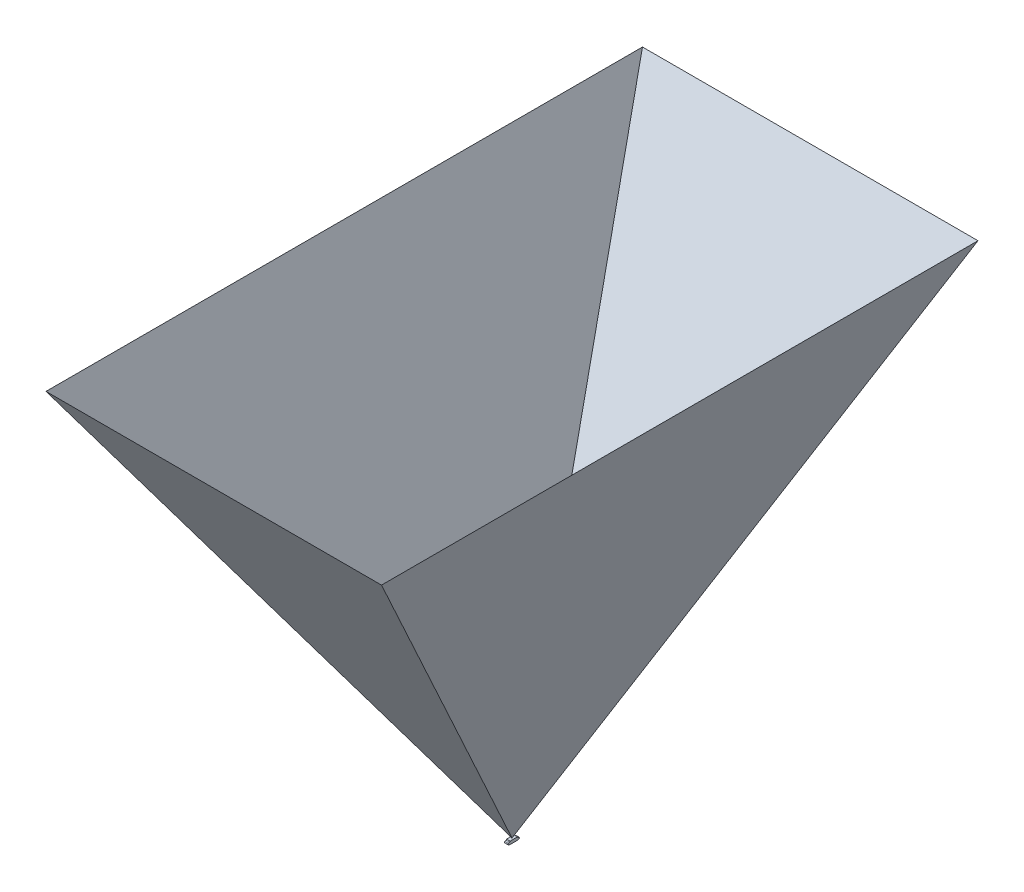
ISO-10303-21;
HEADER;
FILE_DESCRIPTION(('STEP AP214'),'2;1');
FILE_NAME('part.step','',(''),(''),'','','');
FILE_SCHEMA(('AUTOMOTIVE_DESIGN { 1 0 10303 214 1 1 1 1 }'));
ENDSEC;
DATA;
#1=APPLICATION_CONTEXT('core data for automotive mechanical design processes');
#2=APPLICATION_PROTOCOL_DEFINITION('international standard','automotive_design',2000,#1);
#3=PRODUCT_CONTEXT('',#1,'mechanical');
#4=PRODUCT('Part','Part','',(#3));
#5=PRODUCT_RELATED_PRODUCT_CATEGORY('part','',(#4));
#6=PRODUCT_DEFINITION_FORMATION('','',#4);
#7=PRODUCT_DEFINITION_CONTEXT('part definition',#1,'design');
#8=PRODUCT_DEFINITION('design','',#6,#7);
#9=PRODUCT_DEFINITION_SHAPE('','',#8);
#10=(LENGTH_UNIT() NAMED_UNIT(*) SI_UNIT(.MILLI.,.METRE.));
#11=(NAMED_UNIT(*) PLANE_ANGLE_UNIT() SI_UNIT($,.RADIAN.));
#12=(NAMED_UNIT(*) SI_UNIT($,.STERADIAN.) SOLID_ANGLE_UNIT());
#13=UNCERTAINTY_MEASURE_WITH_UNIT(LENGTH_MEASURE(1.E-05),#10,'distance_accuracy_value','');
#14=(GEOMETRIC_REPRESENTATION_CONTEXT(3) GLOBAL_UNCERTAINTY_ASSIGNED_CONTEXT((#13)) GLOBAL_UNIT_ASSIGNED_CONTEXT((#10,
#11,#12)) REPRESENTATION_CONTEXT('',''));
#15=CARTESIAN_POINT('',(0.,0.,0.));
#16=DIRECTION('',(0.,0.,1.));
#17=DIRECTION('',(1.,0.,0.));
#18=AXIS2_PLACEMENT_3D('',#15,#16,#17);
#19=CARTESIAN_POINT('',(0.,0.,0.));
#20=DIRECTION('',(-0.937515374309558,-0.347943850259218,0.));
#21=DIRECTION('',(0.347943850259218,-0.937515374309558,0.));
#22=AXIS2_PLACEMENT_3D('',#19,#20,#21);
#23=PLANE('',#22);
#24=DIRECTION('',(-0.295908180420517,0.797308152799726,0.526058987414252));
#25=VECTOR('',#24,1.);
#26=CARTESIAN_POINT('',(0.,0.,0.));
#27=LINE('',#26,#25);
#28=CARTESIAN_POINT('',(0.,0.,0.));
#29=VERTEX_POINT('',#28);
#30=CARTESIAN_POINT('',(-1371.6,3695.7,2438.4));
#31=VERTEX_POINT('',#30);
#32=EDGE_CURVE('E81',#29,#31,#27,.T.);
#33=ORIENTED_EDGE('',*,*,#32,.T.);
#34=DIRECTION('',(0.,0.,1.));
#35=VECTOR('',#34,1.);
#36=CARTESIAN_POINT('',(-1371.6,3695.7,-2438.4));
#37=LINE('',#36,#35);
#38=CARTESIAN_POINT('',(-1371.6,3695.7,-2438.4));
#39=VERTEX_POINT('',#38);
#40=EDGE_CURVE('E87',#39,#31,#37,.T.);
#41=ORIENTED_EDGE('',*,*,#40,.F.);
#42=DIRECTION('',(-0.295908180420517,0.797308152799726,-0.526058987414252));
#43=VECTOR('',#42,1.);
#44=CARTESIAN_POINT('',(0.,0.,0.));
#45=LINE('',#44,#43);
#46=EDGE_CURVE('E89',#29,#39,#45,.T.);
#47=ORIENTED_EDGE('',*,*,#46,.F.);
#48=EDGE_LOOP('',(#33,#41,#47));
#49=FACE_BOUND('',#48,.T.);
#50=ADVANCED_FACE('F47',(#49),#23,.T.);
#51=CARTESIAN_POINT('',(0.,-2.44569840803106E-13,-3.70676164967207E-13));
#52=DIRECTION('',(0.,0.550722321953465,0.83468851921072));
#53=DIRECTION('',(0.,-0.83468851921072,0.550722321953465));
#54=AXIS2_PLACEMENT_3D('',#51,#52,#53);
#55=PLANE('',#54);
#56=ORIENTED_EDGE('',*,*,#46,.T.);
#57=DIRECTION('',(-1.,0.,0.));
#58=VECTOR('',#57,1.);
#59=CARTESIAN_POINT('',(-1371.6,3695.7,-2438.4));
#60=LINE('',#59,#58);
#61=CARTESIAN_POINT('',(1371.6,3695.7,-2438.4));
#62=VERTEX_POINT('',#61);
#63=EDGE_CURVE('E61',#62,#39,#60,.T.);
#64=ORIENTED_EDGE('',*,*,#63,.F.);
#65=DIRECTION('',(0.295908180420517,0.797308152799726,-0.526058987414252));
#66=VECTOR('',#65,1.);
#67=CARTESIAN_POINT('',(0.,0.,0.));
#68=LINE('',#67,#66);
#69=EDGE_CURVE('E50',#29,#62,#68,.T.);
#70=ORIENTED_EDGE('',*,*,#69,.F.);
#71=EDGE_LOOP('',(#56,#64,#70));
#72=FACE_BOUND('',#71,.T.);
#73=ADVANCED_FACE('F91',(#72),#55,.F.);
#74=CARTESIAN_POINT('',(0.,-2.44569840803106E-13,3.70676164967207E-13));
#75=DIRECTION('',(0.,0.550722321953465,-0.83468851921072));
#76=DIRECTION('',(0.,0.83468851921072,0.550722321953465));
#77=AXIS2_PLACEMENT_3D('',#74,#75,#76);
#78=PLANE('',#77);
#79=DIRECTION('',(0.295908180420517,0.797308152799726,0.526058987414252));
#80=VECTOR('',#79,1.);
#81=CARTESIAN_POINT('',(0.,0.,0.));
#82=LINE('',#81,#80);
#83=CARTESIAN_POINT('',(1371.6,3695.7,2438.4));
#84=VERTEX_POINT('',#83);
#85=EDGE_CURVE('E75',#29,#84,#82,.T.);
#86=ORIENTED_EDGE('',*,*,#85,.T.);
#87=DIRECTION('',(1.,0.,0.));
#88=VECTOR('',#87,1.);
#89=CARTESIAN_POINT('',(-1371.6,3695.7,2438.4));
#90=LINE('',#89,#88);
#91=EDGE_CURVE('E78',#31,#84,#90,.T.);
#92=ORIENTED_EDGE('',*,*,#91,.F.);
#93=ORIENTED_EDGE('',*,*,#32,.F.);
#94=EDGE_LOOP('',(#86,#92,#93));
#95=FACE_BOUND('',#94,.T.);
#96=ADVANCED_FACE('F83',(#95),#78,.F.);
#97=CARTESIAN_POINT('',(0.,0.,0.));
#98=DIRECTION('',(0.937515374309558,-0.347943850259217,0.));
#99=DIRECTION('',(0.347943850259217,0.937515374309558,0.));
#100=AXIS2_PLACEMENT_3D('',#97,#98,#99);
#101=PLANE('',#100);
#102=ORIENTED_EDGE('',*,*,#69,.T.);
#103=DIRECTION('',(0.,0.,-1.));
#104=VECTOR('',#103,1.);
#105=CARTESIAN_POINT('',(1371.6,3695.7,-2438.4));
#106=LINE('',#105,#104);
#107=EDGE_CURVE('E12',#84,#62,#106,.T.);
#108=ORIENTED_EDGE('',*,*,#107,.F.);
#109=ORIENTED_EDGE('',*,*,#85,.F.);
#110=EDGE_LOOP('',(#102,#108,#109));
#111=FACE_BOUND('',#110,.T.);
#112=ADVANCED_FACE('F48',(#111),#101,.T.);
#113=OPEN_SHELL('',(#50,#73,#96,#112));
#114=SHELL_BASED_SURFACE_MODEL('B2',(#113));
#115=CARTESIAN_POINT('',(14.478,0.,30.48));
#116=DIRECTION('',(0.,-1.,0.));
#117=DIRECTION('',(0.,0.,-1.));
#118=AXIS2_PLACEMENT_3D('',#115,#116,#117);
#119=PLANE('',#118);
#120=CARTESIAN_POINT('',(0.,0.,0.));
#121=DIRECTION('',(0.,1.,0.));
#122=DIRECTION('',(0.,0.,1.));
#123=AXIS2_PLACEMENT_3D('',#120,#121,#122);
#124=CIRCLE('',#123,3.175);
#125=CARTESIAN_POINT('',(0.,0.,3.175));
#126=VERTEX_POINT('',#125);
#127=EDGE_CURVE('E325',#126,#126,#124,.T.);
#128=ORIENTED_EDGE('',*,*,#127,.F.);
#129=EDGE_LOOP('',(#128));
#130=FACE_BOUND('',#129,.T.);
#131=DIRECTION('',(0.,0.,1.));
#132=VECTOR('',#131,1.);
#133=CARTESIAN_POINT('',(-14.478,0.,30.48));
#134=LINE('',#133,#132);
#135=CARTESIAN_POINT('',(-14.478,0.,-30.48));
#136=VERTEX_POINT('',#135);
#137=CARTESIAN_POINT('',(-14.478,0.,30.48));
#138=VERTEX_POINT('',#137);
#139=EDGE_CURVE('E221',#136,#138,#134,.T.);
#140=ORIENTED_EDGE('',*,*,#139,.T.);
#141=DIRECTION('',(-1.,0.,0.));
#142=VECTOR('',#141,1.);
#143=CARTESIAN_POINT('',(14.478,0.,30.48));
#144=LINE('',#143,#142);
#145=CARTESIAN_POINT('',(14.478,0.,30.48));
#146=VERTEX_POINT('',#145);
#147=EDGE_CURVE('E146',#146,#138,#144,.T.);
#148=ORIENTED_EDGE('',*,*,#147,.F.);
#149=DIRECTION('',(0.,0.,1.));
#150=VECTOR('',#149,1.);
#151=CARTESIAN_POINT('',(14.478,0.,30.48));
#152=LINE('',#151,#150);
#153=CARTESIAN_POINT('',(14.478,0.,-30.48));
#154=VERTEX_POINT('',#153);
#155=EDGE_CURVE('E233',#154,#146,#152,.T.);
#156=ORIENTED_EDGE('',*,*,#155,.F.);
#157=DIRECTION('',(-1.,0.,0.));
#158=VECTOR('',#157,1.);
#159=CARTESIAN_POINT('',(14.478,0.,-30.48));
#160=LINE('',#159,#158);
#161=EDGE_CURVE('E225',#154,#136,#160,.T.);
#162=ORIENTED_EDGE('',*,*,#161,.T.);
#163=EDGE_LOOP('',(#140,#148,#156,#162));
#164=FACE_BOUND('',#163,.T.);
#165=ADVANCED_FACE('F138',(#130,#164),#119,.F.);
#166=CARTESIAN_POINT('',(14.478,0.,36.9502724798094));
#167=DIRECTION('',(-1.,0.,0.));
#168=DIRECTION('',(0.,0.,1.));
#169=AXIS2_PLACEMENT_3D('',#166,#167,#168);
#170=CYLINDRICAL_SURFACE('',#169,6.47027247980943);
#171=CARTESIAN_POINT('',(-14.478,0.,36.9502724798094));
#172=DIRECTION('',(-1.,0.,0.));
#173=DIRECTION('',(0.,0.,-1.));
#174=AXIS2_PLACEMENT_3D('',#171,#172,#173);
#175=CIRCLE('',#174,6.47027247980943);
#176=CARTESIAN_POINT('',(-14.478,-6.08006730375107,34.7373089589089));
#177=VERTEX_POINT('',#176);
#178=EDGE_CURVE('E224',#138,#177,#175,.T.);
#179=ORIENTED_EDGE('',*,*,#178,.T.);
#180=DIRECTION('',(-1.,0.,0.));
#181=VECTOR('',#180,1.);
#182=CARTESIAN_POINT('',(14.478,-6.08006730375107,34.7373089589089));
#183=LINE('',#182,#181);
#184=CARTESIAN_POINT('',(14.478,-6.08006730375107,34.7373089589089));
#185=VERTEX_POINT('',#184);
#186=EDGE_CURVE('E210',#185,#177,#183,.T.);
#187=ORIENTED_EDGE('',*,*,#186,.F.);
#188=CARTESIAN_POINT('',(14.478,0.,36.9502724798094));
#189=DIRECTION('',(-1.,0.,0.));
#190=DIRECTION('',(0.,0.,-1.));
#191=AXIS2_PLACEMENT_3D('',#188,#189,#190);
#192=CIRCLE('',#191,6.47027247980943);
#193=EDGE_CURVE('E190',#146,#185,#192,.T.);
#194=ORIENTED_EDGE('',*,*,#193,.F.);
#195=ORIENTED_EDGE('',*,*,#147,.T.);
#196=EDGE_LOOP('',(#179,#187,#194,#195));
#197=FACE_BOUND('',#196,.T.);
#198=ADVANCED_FACE('F237',(#197),#170,.F.);
#199=CARTESIAN_POINT('',(14.478,-9.01895185800947,42.811827910118));
#200=DIRECTION('',(0.,-0.93969262078591,-0.342020143325664));
#201=DIRECTION('',(0.,0.342020143325664,-0.93969262078591));
#202=AXIS2_PLACEMENT_3D('',#199,#200,#201);
#203=PLANE('',#202);
#204=DIRECTION('',(0.,-0.342020143325664,0.93969262078591));
#205=VECTOR('',#204,1.);
#206=CARTESIAN_POINT('',(-14.478,-9.01895185800947,42.811827910118));
#207=LINE('',#206,#205);
#208=CARTESIAN_POINT('',(-14.478,-9.01895185800948,42.811827910118));
#209=VERTEX_POINT('',#208);
#210=EDGE_CURVE('E209',#177,#209,#207,.T.);
#211=ORIENTED_EDGE('',*,*,#210,.T.);
#212=DIRECTION('',(-1.,0.,0.));
#213=VECTOR('',#212,1.);
#214=CARTESIAN_POINT('',(14.478,-9.01895185800948,42.811827910118));
#215=LINE('',#214,#213);
#216=CARTESIAN_POINT('',(14.478,-9.01895185800948,42.811827910118));
#217=VERTEX_POINT('',#216);
#218=EDGE_CURVE('E206',#217,#209,#215,.T.);
#219=ORIENTED_EDGE('',*,*,#218,.F.);
#220=DIRECTION('',(0.,-0.342020143325664,0.93969262078591));
#221=VECTOR('',#220,1.);
#222=CARTESIAN_POINT('',(14.478,-9.01895185800947,42.811827910118));
#223=LINE('',#222,#221);
#224=EDGE_CURVE('E198',#185,#217,#223,.T.);
#225=ORIENTED_EDGE('',*,*,#224,.F.);
#226=ORIENTED_EDGE('',*,*,#186,.T.);
#227=EDGE_LOOP('',(#211,#219,#225,#226));
#228=FACE_BOUND('',#227,.T.);
#229=ADVANCED_FACE('F207',(#228),#203,.F.);
#230=CARTESIAN_POINT('',(14.478,-14.986,40.64));
#231=DIRECTION('',(-1.,0.,0.));
#232=DIRECTION('',(0.,0.,1.));
#233=AXIS2_PLACEMENT_3D('',#230,#231,#232);
#234=CYLINDRICAL_SURFACE('',#233,6.35);
#235=CARTESIAN_POINT('',(-14.478,-14.986,40.64));
#236=DIRECTION('',(1.,0.,0.));
#237=DIRECTION('',(0.,0.,1.));
#238=AXIS2_PLACEMENT_3D('',#235,#236,#237);
#239=CIRCLE('',#238,6.35);
#240=CARTESIAN_POINT('',(-14.478,-20.9230196183822,42.89262026337));
#241=VERTEX_POINT('',#240);
#242=EDGE_CURVE('E175',#209,#241,#239,.T.);
#243=ORIENTED_EDGE('',*,*,#242,.T.);
#244=DIRECTION('',(-1.,0.,0.));
#245=VECTOR('',#244,1.);
#246=CARTESIAN_POINT('',(14.478,-20.9230196183822,42.89262026337));
#247=LINE('',#246,#245);
#248=CARTESIAN_POINT('',(14.478,-20.9230196183822,42.89262026337));
#249=VERTEX_POINT('',#248);
#250=EDGE_CURVE('E211',#249,#241,#247,.T.);
#251=ORIENTED_EDGE('',*,*,#250,.F.);
#252=CARTESIAN_POINT('',(14.478,-14.986,40.64));
#253=DIRECTION('',(1.,0.,0.));
#254=DIRECTION('',(0.,0.,1.));
#255=AXIS2_PLACEMENT_3D('',#252,#253,#254);
#256=CIRCLE('',#255,6.35);
#257=EDGE_CURVE('E202',#217,#249,#256,.T.);
#258=ORIENTED_EDGE('',*,*,#257,.F.);
#259=ORIENTED_EDGE('',*,*,#218,.T.);
#260=EDGE_LOOP('',(#243,#251,#258,#259));
#261=FACE_BOUND('',#260,.T.);
#262=ADVANCED_FACE('F213',(#261),#234,.T.);
#263=CARTESIAN_POINT('',(14.478,25.1806363636364,25.4));
#264=DIRECTION('',(-1.,0.,0.));
#265=DIRECTION('',(0.,0.,1.));
#266=AXIS2_PLACEMENT_3D('',#263,#264,#265);
#267=CYLINDRICAL_SURFACE('',#266,49.3106363636364);
#268=CARTESIAN_POINT('',(-14.478,25.1806363636364,25.4));
#269=DIRECTION('',(1.,0.,0.));
#270=DIRECTION('',(0.,0.,1.));
#271=AXIS2_PLACEMENT_3D('',#268,#269,#270);
#272=CIRCLE('',#271,49.3106363636364);
#273=CARTESIAN_POINT('',(-14.478,-24.13,25.4));
#274=VERTEX_POINT('',#273);
#275=EDGE_CURVE('E181',#241,#274,#272,.T.);
#276=ORIENTED_EDGE('',*,*,#275,.T.);
#277=DIRECTION('',(-1.,0.,0.));
#278=VECTOR('',#277,1.);
#279=CARTESIAN_POINT('',(14.478,-24.13,25.4));
#280=LINE('',#279,#278);
#281=CARTESIAN_POINT('',(14.478,-24.13,25.4));
#282=VERTEX_POINT('',#281);
#283=EDGE_CURVE('E220',#282,#274,#280,.T.);
#284=ORIENTED_EDGE('',*,*,#283,.F.);
#285=CARTESIAN_POINT('',(14.478,25.1806363636364,25.4));
#286=DIRECTION('',(1.,0.,0.));
#287=DIRECTION('',(0.,0.,1.));
#288=AXIS2_PLACEMENT_3D('',#285,#286,#287);
#289=CIRCLE('',#288,49.3106363636364);
#290=EDGE_CURVE('E154',#249,#282,#289,.T.);
#291=ORIENTED_EDGE('',*,*,#290,.F.);
#292=ORIENTED_EDGE('',*,*,#250,.T.);
#293=EDGE_LOOP('',(#276,#284,#291,#292));
#294=FACE_BOUND('',#293,.T.);
#295=ADVANCED_FACE('F351',(#294),#267,.T.);
#296=CARTESIAN_POINT('',(14.478,-24.13,0.));
#297=DIRECTION('',(0.,1.,0.));
#298=DIRECTION('',(0.,0.,1.));
#299=AXIS2_PLACEMENT_3D('',#296,#297,#298);
#300=PLANE('',#299);
#301=CARTESIAN_POINT('',(3.302,-24.13,-15.875));
#302=DIRECTION('',(0.,1.,0.));
#303=DIRECTION('',(0.,0.,1.));
#304=AXIS2_PLACEMENT_3D('',#301,#302,#303);
#305=CIRCLE('',#304,2.54);
#306=CARTESIAN_POINT('',(3.302,-24.13,-13.335));
#307=VERTEX_POINT('',#306);
#308=EDGE_CURVE('E45',#307,#307,#305,.F.);
#309=ORIENTED_EDGE('',*,*,#308,.F.);
#310=EDGE_LOOP('',(#309));
#311=FACE_BOUND('',#310,.T.);
#312=DIRECTION('',(0.,0.,-1.));
#313=VECTOR('',#312,1.);
#314=CARTESIAN_POINT('',(-14.478,-24.13,0.));
#315=LINE('',#314,#313);
#316=CARTESIAN_POINT('',(-14.478,-24.13,-25.4));
#317=VERTEX_POINT('',#316);
#318=EDGE_CURVE('E230',#274,#317,#315,.T.);
#319=ORIENTED_EDGE('',*,*,#318,.T.);
#320=DIRECTION('',(-1.,0.,0.));
#321=VECTOR('',#320,1.);
#322=CARTESIAN_POINT('',(14.478,-24.13,-25.4));
#323=LINE('',#322,#321);
#324=CARTESIAN_POINT('',(14.478,-24.13,-25.4));
#325=VERTEX_POINT('',#324);
#326=EDGE_CURVE('E277',#325,#317,#323,.T.);
#327=ORIENTED_EDGE('',*,*,#326,.F.);
#328=DIRECTION('',(0.,0.,-1.));
#329=VECTOR('',#328,1.);
#330=CARTESIAN_POINT('',(14.478,-24.13,0.));
#331=LINE('',#330,#329);
#332=EDGE_CURVE('E215',#282,#325,#331,.T.);
#333=ORIENTED_EDGE('',*,*,#332,.F.);
#334=ORIENTED_EDGE('',*,*,#283,.T.);
#335=EDGE_LOOP('',(#319,#327,#333,#334));
#336=FACE_BOUND('',#335,.T.);
#337=ADVANCED_FACE('F354',(#311,#336),#300,.F.);
#338=CARTESIAN_POINT('',(14.478,25.1806363636364,25.4));
#339=DIRECTION('',(-1.,0.,0.));
#340=DIRECTION('',(0.,0.,1.));
#341=AXIS2_PLACEMENT_3D('',#338,#339,#340);
#342=PLANE('',#341);
#343=ORIENTED_EDGE('',*,*,#155,.T.);
#344=ORIENTED_EDGE('',*,*,#193,.T.);
#345=ORIENTED_EDGE('',*,*,#224,.T.);
#346=ORIENTED_EDGE('',*,*,#257,.T.);
#347=ORIENTED_EDGE('',*,*,#290,.T.);
#348=ORIENTED_EDGE('',*,*,#332,.T.);
#349=CARTESIAN_POINT('',(14.478,25.1806363636364,-25.4));
#350=DIRECTION('',(-1.,0.,0.));
#351=DIRECTION('',(0.,0.,-1.));
#352=AXIS2_PLACEMENT_3D('',#349,#350,#351);
#353=CIRCLE('',#352,49.3106363636364);
#354=CARTESIAN_POINT('',(14.478,-20.9230196183822,-42.89262026337));
#355=VERTEX_POINT('',#354);
#356=EDGE_CURVE('E268',#355,#325,#353,.T.);
#357=ORIENTED_EDGE('',*,*,#356,.F.);
#358=CARTESIAN_POINT('',(14.478,-14.986,-40.64));
#359=DIRECTION('',(-1.,0.,0.));
#360=DIRECTION('',(0.,0.,-1.));
#361=AXIS2_PLACEMENT_3D('',#358,#359,#360);
#362=CIRCLE('',#361,6.35);
#363=CARTESIAN_POINT('',(14.478,-9.01895185800948,-42.811827910118));
#364=VERTEX_POINT('',#363);
#365=EDGE_CURVE('E317',#364,#355,#362,.T.);
#366=ORIENTED_EDGE('',*,*,#365,.F.);
#367=DIRECTION('',(0.,-0.342020143325664,-0.93969262078591));
#368=VECTOR('',#367,1.);
#369=CARTESIAN_POINT('',(14.478,-9.01895185800947,-42.811827910118));
#370=LINE('',#369,#368);
#371=CARTESIAN_POINT('',(14.478,-6.08006730375107,-34.7373089589089));
#372=VERTEX_POINT('',#371);
#373=EDGE_CURVE('E321',#372,#364,#370,.T.);
#374=ORIENTED_EDGE('',*,*,#373,.F.);
#375=CARTESIAN_POINT('',(14.478,0.,-36.9502724798094));
#376=DIRECTION('',(1.,0.,0.));
#377=DIRECTION('',(0.,0.,1.));
#378=AXIS2_PLACEMENT_3D('',#375,#376,#377);
#379=CIRCLE('',#378,6.47027247980943);
#380=EDGE_CURVE('E276',#154,#372,#379,.T.);
#381=ORIENTED_EDGE('',*,*,#380,.F.);
#382=EDGE_LOOP('',(#343,#344,#345,#346,#347,#348,#357,#366,#374,#381));
#383=FACE_BOUND('',#382,.T.);
#384=ADVANCED_FACE('F200',(#383),#342,.F.);
#385=CARTESIAN_POINT('',(-14.478,25.1806363636364,25.4));
#386=DIRECTION('',(-1.,0.,0.));
#387=DIRECTION('',(0.,0.,1.));
#388=AXIS2_PLACEMENT_3D('',#385,#386,#387);
#389=PLANE('',#388);
#390=ORIENTED_EDGE('',*,*,#139,.F.);
#391=CARTESIAN_POINT('',(-14.478,0.,-36.9502724798094));
#392=DIRECTION('',(1.,0.,0.));
#393=DIRECTION('',(0.,0.,1.));
#394=AXIS2_PLACEMENT_3D('',#391,#392,#393);
#395=CIRCLE('',#394,6.47027247980943);
#396=CARTESIAN_POINT('',(-14.478,-6.08006730375107,-34.7373089589089));
#397=VERTEX_POINT('',#396);
#398=EDGE_CURVE('E250',#136,#397,#395,.T.);
#399=ORIENTED_EDGE('',*,*,#398,.T.);
#400=DIRECTION('',(0.,-0.342020143325664,-0.93969262078591));
#401=VECTOR('',#400,1.);
#402=CARTESIAN_POINT('',(-14.478,-9.01895185800947,-42.811827910118));
#403=LINE('',#402,#401);
#404=CARTESIAN_POINT('',(-14.478,-9.01895185800948,-42.811827910118));
#405=VERTEX_POINT('',#404);
#406=EDGE_CURVE('E259',#397,#405,#403,.T.);
#407=ORIENTED_EDGE('',*,*,#406,.T.);
#408=CARTESIAN_POINT('',(-14.478,-14.986,-40.64));
#409=DIRECTION('',(-1.,0.,0.));
#410=DIRECTION('',(0.,0.,-1.));
#411=AXIS2_PLACEMENT_3D('',#408,#409,#410);
#412=CIRCLE('',#411,6.35);
#413=CARTESIAN_POINT('',(-14.478,-20.9230196183822,-42.89262026337));
#414=VERTEX_POINT('',#413);
#415=EDGE_CURVE('E262',#405,#414,#412,.T.);
#416=ORIENTED_EDGE('',*,*,#415,.T.);
#417=CARTESIAN_POINT('',(-14.478,25.1806363636364,-25.4));
#418=DIRECTION('',(-1.,0.,0.));
#419=DIRECTION('',(0.,0.,-1.));
#420=AXIS2_PLACEMENT_3D('',#417,#418,#419);
#421=CIRCLE('',#420,49.3106363636364);
#422=EDGE_CURVE('E273',#414,#317,#421,.T.);
#423=ORIENTED_EDGE('',*,*,#422,.T.);
#424=ORIENTED_EDGE('',*,*,#318,.F.);
#425=ORIENTED_EDGE('',*,*,#275,.F.);
#426=ORIENTED_EDGE('',*,*,#242,.F.);
#427=ORIENTED_EDGE('',*,*,#210,.F.);
#428=ORIENTED_EDGE('',*,*,#178,.F.);
#429=EDGE_LOOP('',(#390,#399,#407,#416,#423,#424,#425,#426,#427,#428));
#430=FACE_BOUND('',#429,.T.);
#431=ADVANCED_FACE('F247',(#430),#389,.T.);
#432=CARTESIAN_POINT('',(14.478,0.,-36.9502724798094));
#433=DIRECTION('',(-1.,0.,0.));
#434=DIRECTION('',(0.,0.,-1.));
#435=AXIS2_PLACEMENT_3D('',#432,#433,#434);
#436=CYLINDRICAL_SURFACE('',#435,6.47027247980943);
#437=ORIENTED_EDGE('',*,*,#398,.F.);
#438=ORIENTED_EDGE('',*,*,#161,.F.);
#439=ORIENTED_EDGE('',*,*,#380,.T.);
#440=DIRECTION('',(-1.,0.,0.));
#441=VECTOR('',#440,1.);
#442=CARTESIAN_POINT('',(14.478,-6.08006730375107,-34.7373089589089));
#443=LINE('',#442,#441);
#444=EDGE_CURVE('E258',#372,#397,#443,.T.);
#445=ORIENTED_EDGE('',*,*,#444,.T.);
#446=EDGE_LOOP('',(#437,#438,#439,#445));
#447=FACE_BOUND('',#446,.T.);
#448=ADVANCED_FACE('F254',(#447),#436,.F.);
#449=CARTESIAN_POINT('',(14.478,-9.01895185800947,-42.811827910118));
#450=DIRECTION('',(0.,-0.93969262078591,0.342020143325664));
#451=DIRECTION('',(0.,0.342020143325664,0.93969262078591));
#452=AXIS2_PLACEMENT_3D('',#449,#450,#451);
#453=PLANE('',#452);
#454=ORIENTED_EDGE('',*,*,#406,.F.);
#455=ORIENTED_EDGE('',*,*,#444,.F.);
#456=ORIENTED_EDGE('',*,*,#373,.T.);
#457=DIRECTION('',(-1.,0.,0.));
#458=VECTOR('',#457,1.);
#459=CARTESIAN_POINT('',(14.478,-9.01895185800948,-42.811827910118));
#460=LINE('',#459,#458);
#461=EDGE_CURVE('E283',#364,#405,#460,.T.);
#462=ORIENTED_EDGE('',*,*,#461,.T.);
#463=EDGE_LOOP('',(#454,#455,#456,#462));
#464=FACE_BOUND('',#463,.T.);
#465=ADVANCED_FACE('F319',(#464),#453,.F.);
#466=CARTESIAN_POINT('',(14.478,-14.986,-40.64));
#467=DIRECTION('',(-1.,0.,0.));
#468=DIRECTION('',(0.,0.,-1.));
#469=AXIS2_PLACEMENT_3D('',#466,#467,#468);
#470=CYLINDRICAL_SURFACE('',#469,6.35);
#471=ORIENTED_EDGE('',*,*,#415,.F.);
#472=ORIENTED_EDGE('',*,*,#461,.F.);
#473=ORIENTED_EDGE('',*,*,#365,.T.);
#474=DIRECTION('',(-1.,0.,0.));
#475=VECTOR('',#474,1.);
#476=CARTESIAN_POINT('',(14.478,-20.9230196183822,-42.89262026337));
#477=LINE('',#476,#475);
#478=EDGE_CURVE('E280',#355,#414,#477,.T.);
#479=ORIENTED_EDGE('',*,*,#478,.T.);
#480=EDGE_LOOP('',(#471,#472,#473,#479));
#481=FACE_BOUND('',#480,.T.);
#482=ADVANCED_FACE('F315',(#481),#470,.T.);
#483=CARTESIAN_POINT('',(14.478,25.1806363636364,-25.4));
#484=DIRECTION('',(-1.,0.,0.));
#485=DIRECTION('',(0.,0.,-1.));
#486=AXIS2_PLACEMENT_3D('',#483,#484,#485);
#487=CYLINDRICAL_SURFACE('',#486,49.3106363636364);
#488=ORIENTED_EDGE('',*,*,#422,.F.);
#489=ORIENTED_EDGE('',*,*,#478,.F.);
#490=ORIENTED_EDGE('',*,*,#356,.T.);
#491=ORIENTED_EDGE('',*,*,#326,.T.);
#492=EDGE_LOOP('',(#488,#489,#490,#491));
#493=FACE_BOUND('',#492,.T.);
#494=ADVANCED_FACE('F309',(#493),#487,.T.);
#495=CARTESIAN_POINT('',(3.302,-31.75,-15.875));
#496=DIRECTION('',(0.,1.,0.));
#497=DIRECTION('',(0.,0.,1.));
#498=AXIS2_PLACEMENT_3D('',#495,#496,#497);
#499=CYLINDRICAL_SURFACE('',#498,2.54);
#500=CARTESIAN_POINT('',(3.302,-31.75,-15.875));
#501=DIRECTION('',(0.,-1.,0.));
#502=DIRECTION('',(0.,0.,-1.));
#503=AXIS2_PLACEMENT_3D('',#500,#501,#502);
#504=CIRCLE('',#503,2.54);
#505=CARTESIAN_POINT('',(3.302,-31.75,-13.335));
#506=VERTEX_POINT('',#505);
#507=EDGE_CURVE('E260',#506,#506,#504,.T.);
#508=CARTESIAN_POINT('',(3.302,-31.75,-13.335));
#509=CARTESIAN_POINT('',(3.302,-31.670625,-13.335));
#510=CARTESIAN_POINT('',(3.302,-31.59125,-13.335));
#511=CARTESIAN_POINT('',(3.302,-31.4325,-13.335));
#512=CARTESIAN_POINT('',(3.302,-31.353125,-13.335));
#513=CARTESIAN_POINT('',(3.302,-31.194375,-13.335));
#514=CARTESIAN_POINT('',(3.302,-31.115,-13.335));
#515=CARTESIAN_POINT('',(3.302,-30.95625,-13.335));
#516=CARTESIAN_POINT('',(3.302,-30.876875,-13.335));
#517=CARTESIAN_POINT('',(3.302,-30.718125,-13.335));
#518=CARTESIAN_POINT('',(3.302,-30.63875,-13.335));
#519=CARTESIAN_POINT('',(3.302,-30.48,-13.335));
#520=CARTESIAN_POINT('',(3.302,-30.400625,-13.335));
#521=CARTESIAN_POINT('',(3.302,-30.241875,-13.335));
#522=CARTESIAN_POINT('',(3.302,-30.1625,-13.335));
#523=CARTESIAN_POINT('',(3.302,-30.00375,-13.335));
#524=CARTESIAN_POINT('',(3.302,-29.924375,-13.335));
#525=CARTESIAN_POINT('',(3.302,-29.765625,-13.335));
#526=CARTESIAN_POINT('',(3.302,-29.68625,-13.335));
#527=CARTESIAN_POINT('',(3.302,-29.5275,-13.335));
#528=CARTESIAN_POINT('',(3.302,-29.448125,-13.335));
#529=CARTESIAN_POINT('',(3.302,-29.289375,-13.335));
#530=CARTESIAN_POINT('',(3.302,-29.21,-13.335));
#531=CARTESIAN_POINT('',(3.302,-29.05125,-13.335));
#532=CARTESIAN_POINT('',(3.302,-28.971875,-13.335));
#533=CARTESIAN_POINT('',(3.302,-28.813125,-13.335));
#534=CARTESIAN_POINT('',(3.302,-28.73375,-13.335));
#535=CARTESIAN_POINT('',(3.302,-28.575,-13.335));
#536=CARTESIAN_POINT('',(3.302,-28.495625,-13.335));
#537=CARTESIAN_POINT('',(3.302,-28.336875,-13.335));
#538=CARTESIAN_POINT('',(3.302,-28.2575,-13.335));
#539=CARTESIAN_POINT('',(3.302,-28.09875,-13.335));
#540=CARTESIAN_POINT('',(3.302,-28.019375,-13.335));
#541=CARTESIAN_POINT('',(3.302,-27.860625,-13.335));
#542=CARTESIAN_POINT('',(3.302,-27.78125,-13.335));
#543=CARTESIAN_POINT('',(3.302,-27.6225,-13.335));
#544=CARTESIAN_POINT('',(3.302,-27.543125,-13.335));
#545=CARTESIAN_POINT('',(3.302,-27.384375,-13.335));
#546=CARTESIAN_POINT('',(3.302,-27.305,-13.335));
#547=CARTESIAN_POINT('',(3.302,-27.14625,-13.335));
#548=CARTESIAN_POINT('',(3.302,-27.066875,-13.335));
#549=CARTESIAN_POINT('',(3.302,-26.908125,-13.335));
#550=CARTESIAN_POINT('',(3.302,-26.82875,-13.335));
#551=CARTESIAN_POINT('',(3.302,-26.67,-13.335));
#552=CARTESIAN_POINT('',(3.302,-26.590625,-13.335));
#553=CARTESIAN_POINT('',(3.302,-26.431875,-13.335));
#554=CARTESIAN_POINT('',(3.302,-26.3525,-13.335));
#555=CARTESIAN_POINT('',(3.302,-26.19375,-13.335));
#556=CARTESIAN_POINT('',(3.302,-26.114375,-13.335));
#557=CARTESIAN_POINT('',(3.302,-25.955625,-13.335));
#558=CARTESIAN_POINT('',(3.302,-25.87625,-13.335));
#559=CARTESIAN_POINT('',(3.302,-25.7175,-13.335));
#560=CARTESIAN_POINT('',(3.302,-25.638125,-13.335));
#561=CARTESIAN_POINT('',(3.302,-25.479375,-13.335));
#562=CARTESIAN_POINT('',(3.302,-25.4,-13.335));
#563=CARTESIAN_POINT('',(3.302,-25.24125,-13.335));
#564=CARTESIAN_POINT('',(3.302,-25.161875,-13.335));
#565=CARTESIAN_POINT('',(3.302,-25.003125,-13.335));
#566=CARTESIAN_POINT('',(3.302,-24.92375,-13.335));
#567=CARTESIAN_POINT('',(3.302,-24.765,-13.335));
#568=CARTESIAN_POINT('',(3.302,-24.685625,-13.335));
#569=CARTESIAN_POINT('',(3.302,-24.526875,-13.335));
#570=CARTESIAN_POINT('',(3.302,-24.4475,-13.335));
#571=CARTESIAN_POINT('',(3.302,-24.28875,-13.335));
#572=CARTESIAN_POINT('',(3.302,-24.209375,-13.335));
#573=CARTESIAN_POINT('',(3.302,-24.13,-13.335));
#574=B_SPLINE_CURVE_WITH_KNOTS('',3,(#508,#509,#510,#511,#512,#513,#514,#515,#516,#517,#518,
#519,#520,#521,#522,#523,#524,#525,#526,#527,#528,#529,#530,#531,#532,#533,#534,#535,#536,#537,
#538,#539,#540,#541,#542,#543,#544,#545,#546,#547,#548,#549,#550,#551,#552,#553,#554,#555,#556,
#557,#558,#559,#560,#561,#562,#563,#564,#565,#566,#567,#568,#569,#570,#571,#572,#573),
.UNSPECIFIED.,.F.,.F.,(4,2,2,2,2,2,2,2,2,2,2,2,2,2,2,2,2,2,2,2,2,2,2,2,2,2,2,2,2,2,2,2,4),(0.,
0.238125000000006,0.476250000000004,0.714375000000003,0.952500000000002,1.190625,1.42875,
1.66687500000001,1.905,2.143125,2.38125,2.619375,2.8575,3.095625,3.33375,3.571875,3.81,4.048125,
4.28625000000001,4.524375,4.7625,5.000625,5.23875,5.476875,5.71500000000001,5.953125,6.19125,
6.429375,6.6675,6.90562500000001,7.14375,7.381875,7.62000000000001),.UNSPECIFIED.);
#575=EDGE_CURVE('BSEAM370',#506,#307,#574,.T.);
#576=ORIENTED_EDGE('',*,*,#507,.F.);
#577=ORIENTED_EDGE('',*,*,#308,.T.);
#578=ORIENTED_EDGE('',*,*,#575,.T.);
#579=ORIENTED_EDGE('',*,*,#575,.F.);
#580=EDGE_LOOP('',(#576,#578,#577,#579));
#581=FACE_BOUND('',#580,.T.);
#582=ADVANCED_FACE('F370',(#581),#499,.T.);
#583=CARTESIAN_POINT('',(3.302,-31.75,-15.875));
#584=DIRECTION('',(0.,-1.,0.));
#585=DIRECTION('',(0.,0.,-1.));
#586=AXIS2_PLACEMENT_3D('',#583,#584,#585);
#587=PLANE('',#586);
#588=ORIENTED_EDGE('',*,*,#507,.T.);
#589=EDGE_LOOP('',(#588));
#590=FACE_BOUND('',#589,.T.);
#591=ADVANCED_FACE('F336',(#590),#587,.T.);
#592=CARTESIAN_POINT('',(0.,-0.127,0.));
#593=DIRECTION('',(0.,1.,0.));
#594=DIRECTION('',(0.,0.,1.));
#595=AXIS2_PLACEMENT_3D('',#592,#593,#594);
#596=CYLINDRICAL_SURFACE('',#595,3.175);
#597=CARTESIAN_POINT('',(0.,-0.127,0.));
#598=DIRECTION('',(0.,1.,0.));
#599=DIRECTION('',(0.,0.,1.));
#600=AXIS2_PLACEMENT_3D('',#597,#598,#599);
#601=CIRCLE('',#600,3.175);
#602=CARTESIAN_POINT('',(0.,-0.127,3.175));
#603=VERTEX_POINT('',#602);
#604=EDGE_CURVE('E265',#603,#603,#601,.T.);
#605=ORIENTED_EDGE('',*,*,#604,.F.);
#606=EDGE_LOOP('',(#605));
#607=FACE_BOUND('',#606,.T.);
#608=ORIENTED_EDGE('',*,*,#127,.T.);
#609=EDGE_LOOP('',(#608));
#610=FACE_BOUND('',#609,.T.);
#611=ADVANCED_FACE('F333',(#607,#610),#596,.F.);
#612=CARTESIAN_POINT('',(0.,-0.127,0.));
#613=DIRECTION('',(0.,1.,0.));
#614=DIRECTION('',(0.,0.,1.));
#615=AXIS2_PLACEMENT_3D('',#612,#613,#614);
#616=PLANE('',#615);
#617=ORIENTED_EDGE('',*,*,#604,.T.);
#618=EDGE_LOOP('',(#617));
#619=FACE_BOUND('',#618,.T.);
#620=ADVANCED_FACE('F331',(#619),#616,.T.);
#621=CLOSED_SHELL('',(#165,#198,#229,#262,#295,#337,#384,#431,#448,#465,#482,#494,#582,#591,
#611,#620));
#622=MANIFOLD_SOLID_BREP('B6',#621);
#623=ADVANCED_BREP_SHAPE_REPRESENTATION('',(#18,#622),#14);
#624=MANIFOLD_SURFACE_SHAPE_REPRESENTATION('',(#18,#114),#14);
#625=SHAPE_REPRESENTATION('',(#18),#14);
#626=SHAPE_DEFINITION_REPRESENTATION(#9,#625);
#627=SHAPE_REPRESENTATION_RELATIONSHIP('','',#625,#623);
#628=SHAPE_REPRESENTATION_RELATIONSHIP('','',#625,#624);
ENDSEC;
END-ISO-10303-21;
